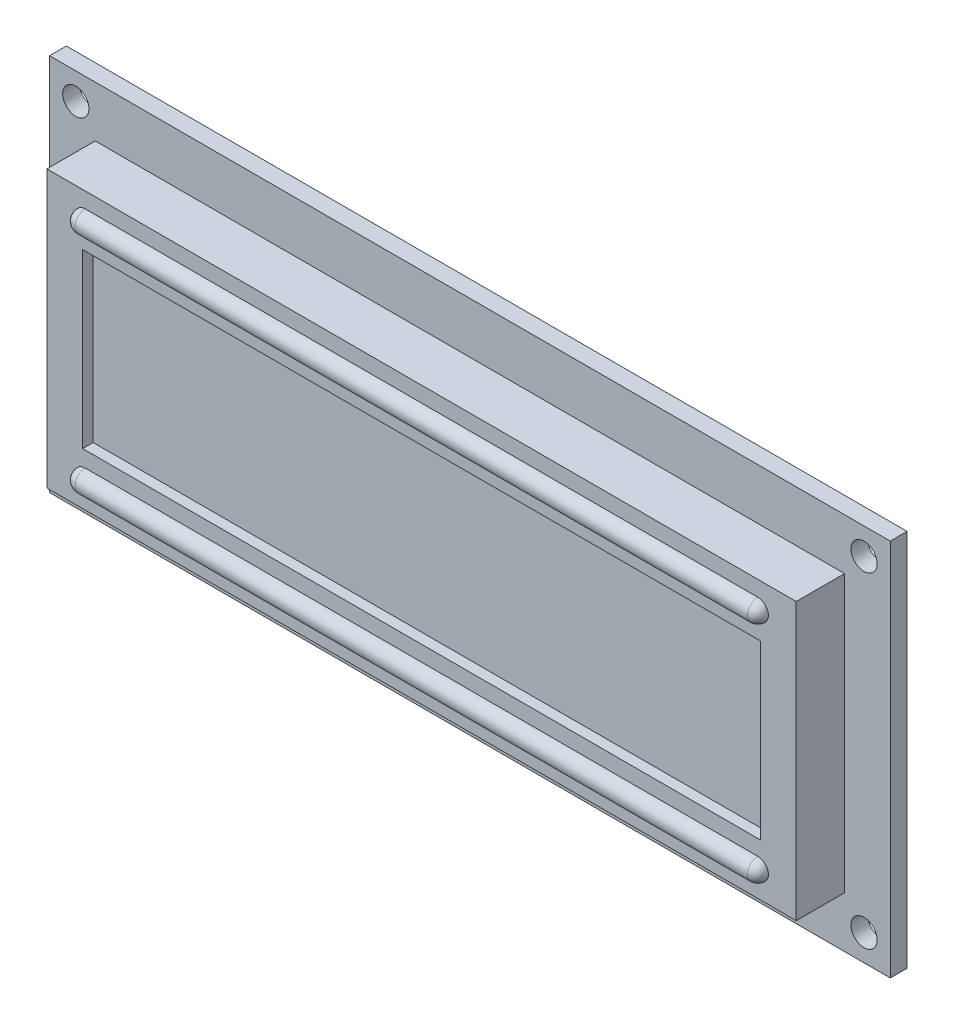
ISO-10303-21;
HEADER;
FILE_DESCRIPTION(('STEP AP214'),'2;1');
FILE_NAME('part.step','',(''),(''),'','','');
FILE_SCHEMA(('AUTOMOTIVE_DESIGN { 1 0 10303 214 1 1 1 1 }'));
ENDSEC;
DATA;
#1=APPLICATION_CONTEXT('core data for automotive mechanical design processes');
#2=APPLICATION_PROTOCOL_DEFINITION('international standard','automotive_design',2000,#1);
#3=PRODUCT_CONTEXT('',#1,'mechanical');
#4=PRODUCT('Part','Part','',(#3));
#5=PRODUCT_RELATED_PRODUCT_CATEGORY('part','',(#4));
#6=PRODUCT_DEFINITION_FORMATION('','',#4);
#7=PRODUCT_DEFINITION_CONTEXT('part definition',#1,'design');
#8=PRODUCT_DEFINITION('design','',#6,#7);
#9=PRODUCT_DEFINITION_SHAPE('','',#8);
#10=(LENGTH_UNIT() NAMED_UNIT(*) SI_UNIT(.MILLI.,.METRE.));
#11=(NAMED_UNIT(*) PLANE_ANGLE_UNIT() SI_UNIT($,.RADIAN.));
#12=(NAMED_UNIT(*) SI_UNIT($,.STERADIAN.) SOLID_ANGLE_UNIT());
#13=UNCERTAINTY_MEASURE_WITH_UNIT(LENGTH_MEASURE(1.E-05),#10,'distance_accuracy_value','');
#14=(GEOMETRIC_REPRESENTATION_CONTEXT(3) GLOBAL_UNCERTAINTY_ASSIGNED_CONTEXT((#13)) GLOBAL_UNIT_ASSIGNED_CONTEXT((#10,
#11,#12)) REPRESENTATION_CONTEXT('',''));
#15=CARTESIAN_POINT('',(0.,0.,0.));
#16=DIRECTION('',(0.,0.,1.));
#17=DIRECTION('',(1.,0.,0.));
#18=AXIS2_PLACEMENT_3D('',#15,#16,#17);
#19=CARTESIAN_POINT('',(0.,0.,6.2));
#20=DIRECTION('',(0.,0.,1.));
#21=DIRECTION('',(1.,0.,0.));
#22=AXIS2_PLACEMENT_3D('',#19,#20,#21);
#23=PLANE('',#22);
#24=DIRECTION('',(0.,-1.,0.));
#25=VECTOR('',#24,1.);
#26=CARTESIAN_POINT('',(75.65,0.,6.2));
#27=LINE('',#26,#25);
#28=CARTESIAN_POINT('',(75.65,31.15,6.2));
#29=VERTEX_POINT('',#28);
#30=CARTESIAN_POINT('',(75.65,4.85,6.2));
#31=VERTEX_POINT('',#30);
#32=EDGE_CURVE('E208',#29,#31,#27,.T.);
#33=ORIENTED_EDGE('',*,*,#32,.F.);
#34=DIRECTION('',(1.,0.,0.));
#35=VECTOR('',#34,1.);
#36=CARTESIAN_POINT('',(0.,31.15,6.2));
#37=LINE('',#36,#35);
#38=CARTESIAN_POINT('',(4.35,31.15,6.2));
#39=VERTEX_POINT('',#38);
#40=EDGE_CURVE('E211',#39,#29,#37,.T.);
#41=ORIENTED_EDGE('',*,*,#40,.F.);
#42=DIRECTION('',(0.,-1.,0.));
#43=VECTOR('',#42,1.);
#44=CARTESIAN_POINT('',(4.35000000000001,0.,6.2));
#45=LINE('',#44,#43);
#46=CARTESIAN_POINT('',(4.35000000000001,4.85,6.2));
#47=VERTEX_POINT('',#46);
#48=EDGE_CURVE('E215',#39,#47,#45,.T.);
#49=ORIENTED_EDGE('',*,*,#48,.T.);
#50=DIRECTION('',(1.,0.,0.));
#51=VECTOR('',#50,1.);
#52=CARTESIAN_POINT('',(0.,4.85,6.2));
#53=LINE('',#52,#51);
#54=EDGE_CURVE('E217',#47,#31,#53,.T.);
#55=ORIENTED_EDGE('',*,*,#54,.T.);
#56=EDGE_LOOP('',(#33,#41,#49,#55));
#57=FACE_BOUND('',#56,.T.);
#58=DIRECTION('',(1.,0.,0.));
#59=VECTOR('',#58,1.);
#60=CARTESIAN_POINT('',(0.,26.2,6.2));
#61=LINE('',#60,#59);
#62=CARTESIAN_POINT('',(7.75,26.2,6.2));
#63=VERTEX_POINT('',#62);
#64=CARTESIAN_POINT('',(72.25,26.2,6.2));
#65=VERTEX_POINT('',#64);
#66=EDGE_CURVE('E192',#63,#65,#61,.T.);
#67=ORIENTED_EDGE('',*,*,#66,.T.);
#68=DIRECTION('',(0.,-1.,0.));
#69=VECTOR('',#68,1.);
#70=CARTESIAN_POINT('',(72.25,0.,6.2));
#71=LINE('',#70,#69);
#72=CARTESIAN_POINT('',(72.25,9.8,6.2));
#73=VERTEX_POINT('',#72);
#74=EDGE_CURVE('E53',#65,#73,#71,.T.);
#75=ORIENTED_EDGE('',*,*,#74,.T.);
#76=DIRECTION('',(1.,0.,0.));
#77=VECTOR('',#76,1.);
#78=CARTESIAN_POINT('',(0.,9.8,6.2));
#79=LINE('',#78,#77);
#80=CARTESIAN_POINT('',(7.75000000000001,9.8,6.2));
#81=VERTEX_POINT('',#80);
#82=EDGE_CURVE('E182',#81,#73,#79,.T.);
#83=ORIENTED_EDGE('',*,*,#82,.F.);
#84=DIRECTION('',(0.,-1.,0.));
#85=VECTOR('',#84,1.);
#86=CARTESIAN_POINT('',(7.75000000000001,0.,6.2));
#87=LINE('',#86,#85);
#88=EDGE_CURVE('E195',#63,#81,#87,.T.);
#89=ORIENTED_EDGE('',*,*,#88,.F.);
#90=EDGE_LOOP('',(#67,#75,#83,#89));
#91=FACE_BOUND('',#90,.T.);
#92=CARTESIAN_POINT('',(8.00000000000001,28.675,6.2));
#93=DIRECTION('',(0.,0.,1.));
#94=DIRECTION('',(1.,0.,0.));
#95=AXIS2_PLACEMENT_3D('',#92,#93,#94);
#96=CIRCLE('',#95,1.);
#97=CARTESIAN_POINT('',(8.,29.675,6.2));
#98=VERTEX_POINT('',#97);
#99=CARTESIAN_POINT('',(8.,27.675,6.2));
#100=VERTEX_POINT('',#99);
#101=EDGE_CURVE('E300',#98,#100,#96,.T.);
#102=ORIENTED_EDGE('',*,*,#101,.F.);
#103=DIRECTION('',(-1.,0.,0.));
#104=VECTOR('',#103,1.);
#105=CARTESIAN_POINT('',(72.,29.675,6.2));
#106=LINE('',#105,#104);
#107=CARTESIAN_POINT('',(72.,29.675,6.2));
#108=VERTEX_POINT('',#107);
#109=EDGE_CURVE('E160',#98,#108,#106,.F.);
#110=ORIENTED_EDGE('',*,*,#109,.T.);
#111=CARTESIAN_POINT('',(72.,28.675,6.2));
#112=DIRECTION('',(0.,0.,1.));
#113=DIRECTION('',(1.,0.,0.));
#114=AXIS2_PLACEMENT_3D('',#111,#112,#113);
#115=CIRCLE('',#114,0.999999999999997);
#116=CARTESIAN_POINT('',(72.,27.675,6.2));
#117=VERTEX_POINT('',#116);
#118=EDGE_CURVE('E172',#117,#108,#115,.T.);
#119=ORIENTED_EDGE('',*,*,#118,.F.);
#120=DIRECTION('',(-1.,0.,0.));
#121=VECTOR('',#120,1.);
#122=CARTESIAN_POINT('',(72.,27.675,6.2));
#123=LINE('',#122,#121);
#124=EDGE_CURVE('E291',#117,#100,#123,.T.);
#125=ORIENTED_EDGE('',*,*,#124,.T.);
#126=EDGE_LOOP('',(#102,#110,#119,#125));
#127=FACE_BOUND('',#126,.T.);
#128=DIRECTION('',(-1.,0.,0.));
#129=VECTOR('',#128,1.);
#130=CARTESIAN_POINT('',(72.,8.32499999999999,6.2));
#131=LINE('',#130,#129);
#132=CARTESIAN_POINT('',(8.,8.325,6.2));
#133=VERTEX_POINT('',#132);
#134=CARTESIAN_POINT('',(72.,8.32499999999999,6.2));
#135=VERTEX_POINT('',#134);
#136=EDGE_CURVE('E11',#133,#135,#131,.F.);
#137=ORIENTED_EDGE('',*,*,#136,.T.);
#138=CARTESIAN_POINT('',(72.,7.32499999999999,6.2));
#139=DIRECTION('',(0.,0.,1.));
#140=DIRECTION('',(1.,0.,0.));
#141=AXIS2_PLACEMENT_3D('',#138,#139,#140);
#142=CIRCLE('',#141,0.999999999999997);
#143=CARTESIAN_POINT('',(72.,6.325,6.2));
#144=VERTEX_POINT('',#143);
#145=EDGE_CURVE('E162',#135,#144,#142,.F.);
#146=ORIENTED_EDGE('',*,*,#145,.T.);
#147=DIRECTION('',(-1.,0.,0.));
#148=VECTOR('',#147,1.);
#149=CARTESIAN_POINT('',(72.,6.32499999999999,6.2));
#150=LINE('',#149,#148);
#151=CARTESIAN_POINT('',(8.,6.32499999999999,6.2));
#152=VERTEX_POINT('',#151);
#153=EDGE_CURVE('E46',#144,#152,#150,.T.);
#154=ORIENTED_EDGE('',*,*,#153,.T.);
#155=CARTESIAN_POINT('',(8.00000000000001,7.32499999999999,6.2));
#156=DIRECTION('',(0.,0.,1.));
#157=DIRECTION('',(1.,0.,0.));
#158=AXIS2_PLACEMENT_3D('',#155,#156,#157);
#159=CIRCLE('',#158,1.);
#160=EDGE_CURVE('E164',#133,#152,#159,.T.);
#161=ORIENTED_EDGE('',*,*,#160,.F.);
#162=EDGE_LOOP('',(#137,#146,#154,#161));
#163=FACE_BOUND('',#162,.T.);
#164=ADVANCED_FACE('F38',(#57,#91,#127,#163),#23,.T.);
#165=CARTESIAN_POINT('',(0.,0.,1.6));
#166=DIRECTION('',(0.,0.,-1.));
#167=DIRECTION('',(-1.,0.,0.));
#168=AXIS2_PLACEMENT_3D('',#165,#166,#167);
#169=PLANE('',#168);
#170=DIRECTION('',(1.,0.,0.));
#171=VECTOR('',#170,1.);
#172=CARTESIAN_POINT('',(0.,31.15,1.6));
#173=LINE('',#172,#171);
#174=CARTESIAN_POINT('',(4.35,31.15,1.6));
#175=VERTEX_POINT('',#174);
#176=CARTESIAN_POINT('',(75.65,31.15,1.6));
#177=VERTEX_POINT('',#176);
#178=EDGE_CURVE('E61',#175,#177,#173,.T.);
#179=ORIENTED_EDGE('',*,*,#178,.T.);
#180=DIRECTION('',(0.,-1.,0.));
#181=VECTOR('',#180,1.);
#182=CARTESIAN_POINT('',(75.65,0.,1.6));
#183=LINE('',#182,#181);
#184=CARTESIAN_POINT('',(75.65,4.85,1.6));
#185=VERTEX_POINT('',#184);
#186=EDGE_CURVE('E202',#177,#185,#183,.T.);
#187=ORIENTED_EDGE('',*,*,#186,.T.);
#188=DIRECTION('',(1.,0.,0.));
#189=VECTOR('',#188,1.);
#190=CARTESIAN_POINT('',(0.,4.85,1.6));
#191=LINE('',#190,#189);
#192=CARTESIAN_POINT('',(4.35000000000001,4.85,1.6));
#193=VERTEX_POINT('',#192);
#194=EDGE_CURVE('E212',#193,#185,#191,.T.);
#195=ORIENTED_EDGE('',*,*,#194,.F.);
#196=DIRECTION('',(0.,-1.,0.));
#197=VECTOR('',#196,1.);
#198=CARTESIAN_POINT('',(4.35000000000001,0.,1.6));
#199=LINE('',#198,#197);
#200=EDGE_CURVE('E222',#175,#193,#199,.T.);
#201=ORIENTED_EDGE('',*,*,#200,.F.);
#202=EDGE_LOOP('',(#179,#187,#195,#201));
#203=FACE_BOUND('',#202,.T.);
#204=CARTESIAN_POINT('',(2.5,2.5,1.6));
#205=DIRECTION('',(0.,0.,1.));
#206=DIRECTION('',(1.,0.,0.));
#207=AXIS2_PLACEMENT_3D('',#204,#205,#206);
#208=CIRCLE('',#207,1.25);
#209=CARTESIAN_POINT('',(3.75,2.5,1.6));
#210=VERTEX_POINT('',#209);
#211=EDGE_CURVE('E244',#210,#210,#208,.T.);
#212=ORIENTED_EDGE('',*,*,#211,.F.);
#213=EDGE_LOOP('',(#212));
#214=FACE_BOUND('',#213,.T.);
#215=CARTESIAN_POINT('',(77.5,33.5,1.6));
#216=DIRECTION('',(0.,0.,1.));
#217=DIRECTION('',(1.,0.,0.));
#218=AXIS2_PLACEMENT_3D('',#215,#216,#217);
#219=CIRCLE('',#218,1.25);
#220=CARTESIAN_POINT('',(78.75,33.5,1.6));
#221=VERTEX_POINT('',#220);
#222=EDGE_CURVE('E256',#221,#221,#219,.T.);
#223=ORIENTED_EDGE('',*,*,#222,.F.);
#224=EDGE_LOOP('',(#223));
#225=FACE_BOUND('',#224,.T.);
#226=DIRECTION('',(0.,-1.,0.));
#227=VECTOR('',#226,1.);
#228=CARTESIAN_POINT('',(0.,0.,1.6));
#229=LINE('',#228,#227);
#230=CARTESIAN_POINT('',(0.,36.,1.6));
#231=VERTEX_POINT('',#230);
#232=CARTESIAN_POINT('',(0.,0.,1.6));
#233=VERTEX_POINT('',#232);
#234=EDGE_CURVE('E262',#231,#233,#229,.T.);
#235=ORIENTED_EDGE('',*,*,#234,.T.);
#236=DIRECTION('',(1.,0.,0.));
#237=VECTOR('',#236,1.);
#238=CARTESIAN_POINT('',(0.,0.,1.6));
#239=LINE('',#238,#237);
#240=CARTESIAN_POINT('',(80.,0.,1.6));
#241=VERTEX_POINT('',#240);
#242=EDGE_CURVE('E265',#233,#241,#239,.T.);
#243=ORIENTED_EDGE('',*,*,#242,.T.);
#244=DIRECTION('',(0.,1.,0.));
#245=VECTOR('',#244,1.);
#246=CARTESIAN_POINT('',(80.,0.,1.6));
#247=LINE('',#246,#245);
#248=CARTESIAN_POINT('',(80.,36.,1.6));
#249=VERTEX_POINT('',#248);
#250=EDGE_CURVE('E268',#241,#249,#247,.T.);
#251=ORIENTED_EDGE('',*,*,#250,.T.);
#252=DIRECTION('',(-1.,0.,0.));
#253=VECTOR('',#252,1.);
#254=CARTESIAN_POINT('',(0.,36.,1.6));
#255=LINE('',#254,#253);
#256=EDGE_CURVE('E270',#249,#231,#255,.T.);
#257=ORIENTED_EDGE('',*,*,#256,.T.);
#258=EDGE_LOOP('',(#235,#243,#251,#257));
#259=FACE_BOUND('',#258,.T.);
#260=CARTESIAN_POINT('',(77.5,2.5,1.6));
#261=DIRECTION('',(0.,0.,1.));
#262=DIRECTION('',(1.,0.,0.));
#263=AXIS2_PLACEMENT_3D('',#260,#261,#262);
#264=CIRCLE('',#263,1.25);
#265=CARTESIAN_POINT('',(78.75,2.5,1.6));
#266=VERTEX_POINT('',#265);
#267=EDGE_CURVE('E250',#266,#266,#264,.T.);
#268=ORIENTED_EDGE('',*,*,#267,.F.);
#269=EDGE_LOOP('',(#268));
#270=FACE_BOUND('',#269,.T.);
#271=CARTESIAN_POINT('',(2.5,33.5,1.6));
#272=DIRECTION('',(0.,0.,1.));
#273=DIRECTION('',(1.,0.,0.));
#274=AXIS2_PLACEMENT_3D('',#271,#272,#273);
#275=CIRCLE('',#274,1.25);
#276=CARTESIAN_POINT('',(3.75,33.5,1.6));
#277=VERTEX_POINT('',#276);
#278=EDGE_CURVE('E238',#277,#277,#275,.T.);
#279=ORIENTED_EDGE('',*,*,#278,.F.);
#280=EDGE_LOOP('',(#279));
#281=FACE_BOUND('',#280,.T.);
#282=ADVANCED_FACE('F318',(#203,#214,#225,#259,#270,#281),#169,.F.);
#283=CARTESIAN_POINT('',(0.,0.,0.));
#284=DIRECTION('',(0.,0.,-1.));
#285=DIRECTION('',(-1.,0.,0.));
#286=AXIS2_PLACEMENT_3D('',#283,#284,#285);
#287=PLANE('',#286);
#288=CARTESIAN_POINT('',(2.5,2.5,0.));
#289=DIRECTION('',(0.,0.,1.));
#290=DIRECTION('',(1.,0.,0.));
#291=AXIS2_PLACEMENT_3D('',#288,#289,#290);
#292=CIRCLE('',#291,1.25);
#293=CARTESIAN_POINT('',(3.75,2.5,0.));
#294=VERTEX_POINT('',#293);
#295=EDGE_CURVE('E241',#294,#294,#292,.T.);
#296=ORIENTED_EDGE('',*,*,#295,.T.);
#297=EDGE_LOOP('',(#296));
#298=FACE_BOUND('',#297,.T.);
#299=CARTESIAN_POINT('',(77.5,33.5,0.));
#300=DIRECTION('',(0.,0.,1.));
#301=DIRECTION('',(1.,0.,0.));
#302=AXIS2_PLACEMENT_3D('',#299,#300,#301);
#303=CIRCLE('',#302,1.25);
#304=CARTESIAN_POINT('',(78.75,33.5,0.));
#305=VERTEX_POINT('',#304);
#306=EDGE_CURVE('E253',#305,#305,#303,.T.);
#307=ORIENTED_EDGE('',*,*,#306,.T.);
#308=EDGE_LOOP('',(#307));
#309=FACE_BOUND('',#308,.T.);
#310=DIRECTION('',(0.,-1.,0.));
#311=VECTOR('',#310,1.);
#312=CARTESIAN_POINT('',(0.,0.,0.));
#313=LINE('',#312,#311);
#314=CARTESIAN_POINT('',(0.,36.,0.));
#315=VERTEX_POINT('',#314);
#316=CARTESIAN_POINT('',(0.,0.,0.));
#317=VERTEX_POINT('',#316);
#318=EDGE_CURVE('E259',#315,#317,#313,.T.);
#319=ORIENTED_EDGE('',*,*,#318,.F.);
#320=DIRECTION('',(-1.,0.,0.));
#321=VECTOR('',#320,1.);
#322=CARTESIAN_POINT('',(0.,36.,0.));
#323=LINE('',#322,#321);
#324=CARTESIAN_POINT('',(80.,36.,0.));
#325=VERTEX_POINT('',#324);
#326=EDGE_CURVE('E266',#325,#315,#323,.T.);
#327=ORIENTED_EDGE('',*,*,#326,.F.);
#328=DIRECTION('',(0.,1.,0.));
#329=VECTOR('',#328,1.);
#330=CARTESIAN_POINT('',(80.,0.,0.));
#331=LINE('',#330,#329);
#332=CARTESIAN_POINT('',(80.,0.,0.));
#333=VERTEX_POINT('',#332);
#334=EDGE_CURVE('E277',#333,#325,#331,.T.);
#335=ORIENTED_EDGE('',*,*,#334,.F.);
#336=DIRECTION('',(1.,0.,0.));
#337=VECTOR('',#336,1.);
#338=CARTESIAN_POINT('',(0.,0.,0.));
#339=LINE('',#338,#337);
#340=EDGE_CURVE('E275',#317,#333,#339,.T.);
#341=ORIENTED_EDGE('',*,*,#340,.F.);
#342=EDGE_LOOP('',(#319,#327,#335,#341));
#343=FACE_BOUND('',#342,.T.);
#344=CARTESIAN_POINT('',(77.5,2.5,0.));
#345=DIRECTION('',(0.,0.,1.));
#346=DIRECTION('',(1.,0.,0.));
#347=AXIS2_PLACEMENT_3D('',#344,#345,#346);
#348=CIRCLE('',#347,1.25);
#349=CARTESIAN_POINT('',(78.75,2.5,0.));
#350=VERTEX_POINT('',#349);
#351=EDGE_CURVE('E247',#350,#350,#348,.T.);
#352=ORIENTED_EDGE('',*,*,#351,.T.);
#353=EDGE_LOOP('',(#352));
#354=FACE_BOUND('',#353,.T.);
#355=CARTESIAN_POINT('',(2.5,33.5,0.));
#356=DIRECTION('',(0.,0.,1.));
#357=DIRECTION('',(1.,0.,0.));
#358=AXIS2_PLACEMENT_3D('',#355,#356,#357);
#359=CIRCLE('',#358,1.25);
#360=CARTESIAN_POINT('',(3.75,33.5,0.));
#361=VERTEX_POINT('',#360);
#362=EDGE_CURVE('E237',#361,#361,#359,.T.);
#363=ORIENTED_EDGE('',*,*,#362,.T.);
#364=EDGE_LOOP('',(#363));
#365=FACE_BOUND('',#364,.T.);
#366=ADVANCED_FACE('F324',(#298,#309,#343,#354,#365),#287,.T.);
#367=CARTESIAN_POINT('',(0.,0.,1.6));
#368=DIRECTION('',(1.,0.,0.));
#369=DIRECTION('',(0.,0.,-1.));
#370=AXIS2_PLACEMENT_3D('',#367,#368,#369);
#371=PLANE('',#370);
#372=ORIENTED_EDGE('',*,*,#318,.T.);
#373=DIRECTION('',(0.,0.,-1.));
#374=VECTOR('',#373,1.);
#375=CARTESIAN_POINT('',(0.,0.,1.6));
#376=LINE('',#375,#374);
#377=EDGE_CURVE('E288',#233,#317,#376,.T.);
#378=ORIENTED_EDGE('',*,*,#377,.F.);
#379=ORIENTED_EDGE('',*,*,#234,.F.);
#380=DIRECTION('',(0.,0.,-1.));
#381=VECTOR('',#380,1.);
#382=CARTESIAN_POINT('',(0.,36.,1.6));
#383=LINE('',#382,#381);
#384=EDGE_CURVE('E272',#231,#315,#383,.T.);
#385=ORIENTED_EDGE('',*,*,#384,.T.);
#386=EDGE_LOOP('',(#372,#378,#379,#385));
#387=FACE_BOUND('',#386,.T.);
#388=ADVANCED_FACE('F40',(#387),#371,.F.);
#389=CARTESIAN_POINT('',(0.,0.,1.6));
#390=DIRECTION('',(0.,1.,0.));
#391=DIRECTION('',(0.,0.,1.));
#392=AXIS2_PLACEMENT_3D('',#389,#390,#391);
#393=PLANE('',#392);
#394=ORIENTED_EDGE('',*,*,#340,.T.);
#395=DIRECTION('',(0.,0.,-1.));
#396=VECTOR('',#395,1.);
#397=CARTESIAN_POINT('',(80.,0.,1.6));
#398=LINE('',#397,#396);
#399=EDGE_CURVE('E285',#241,#333,#398,.T.);
#400=ORIENTED_EDGE('',*,*,#399,.F.);
#401=ORIENTED_EDGE('',*,*,#242,.F.);
#402=ORIENTED_EDGE('',*,*,#377,.T.);
#403=EDGE_LOOP('',(#394,#400,#401,#402));
#404=FACE_BOUND('',#403,.T.);
#405=ADVANCED_FACE('F373',(#404),#393,.F.);
#406=CARTESIAN_POINT('',(80.,0.,1.6));
#407=DIRECTION('',(-1.,0.,0.));
#408=DIRECTION('',(0.,0.,1.));
#409=AXIS2_PLACEMENT_3D('',#406,#407,#408);
#410=PLANE('',#409);
#411=ORIENTED_EDGE('',*,*,#334,.T.);
#412=DIRECTION('',(0.,0.,-1.));
#413=VECTOR('',#412,1.);
#414=CARTESIAN_POINT('',(80.,36.,1.6));
#415=LINE('',#414,#413);
#416=EDGE_CURVE('E282',#249,#325,#415,.T.);
#417=ORIENTED_EDGE('',*,*,#416,.F.);
#418=ORIENTED_EDGE('',*,*,#250,.F.);
#419=ORIENTED_EDGE('',*,*,#399,.T.);
#420=EDGE_LOOP('',(#411,#417,#418,#419));
#421=FACE_BOUND('',#420,.T.);
#422=ADVANCED_FACE('F370',(#421),#410,.F.);
#423=CARTESIAN_POINT('',(0.,36.,1.6));
#424=DIRECTION('',(0.,-1.,0.));
#425=DIRECTION('',(0.,0.,-1.));
#426=AXIS2_PLACEMENT_3D('',#423,#424,#425);
#427=PLANE('',#426);
#428=ORIENTED_EDGE('',*,*,#326,.T.);
#429=ORIENTED_EDGE('',*,*,#384,.F.);
#430=ORIENTED_EDGE('',*,*,#256,.F.);
#431=ORIENTED_EDGE('',*,*,#416,.T.);
#432=EDGE_LOOP('',(#428,#429,#430,#431));
#433=FACE_BOUND('',#432,.T.);
#434=ADVANCED_FACE('F362',(#433),#427,.F.);
#435=CARTESIAN_POINT('',(77.5,33.5,1.6));
#436=DIRECTION('',(0.,0.,-1.));
#437=DIRECTION('',(-1.,0.,0.));
#438=AXIS2_PLACEMENT_3D('',#435,#436,#437);
#439=CYLINDRICAL_SURFACE('',#438,1.25);
#440=ORIENTED_EDGE('',*,*,#222,.T.);
#441=EDGE_LOOP('',(#440));
#442=FACE_BOUND('',#441,.T.);
#443=ORIENTED_EDGE('',*,*,#306,.F.);
#444=EDGE_LOOP('',(#443));
#445=FACE_BOUND('',#444,.T.);
#446=ADVANCED_FACE('F359',(#442,#445),#439,.F.);
#447=CARTESIAN_POINT('',(77.5,2.5,1.6));
#448=DIRECTION('',(0.,0.,-1.));
#449=DIRECTION('',(-1.,0.,0.));
#450=AXIS2_PLACEMENT_3D('',#447,#448,#449);
#451=CYLINDRICAL_SURFACE('',#450,1.25);
#452=ORIENTED_EDGE('',*,*,#267,.T.);
#453=EDGE_LOOP('',(#452));
#454=FACE_BOUND('',#453,.T.);
#455=ORIENTED_EDGE('',*,*,#351,.F.);
#456=EDGE_LOOP('',(#455));
#457=FACE_BOUND('',#456,.T.);
#458=ADVANCED_FACE('F355',(#454,#457),#451,.F.);
#459=CARTESIAN_POINT('',(2.5,2.5,1.6));
#460=DIRECTION('',(0.,0.,-1.));
#461=DIRECTION('',(-1.,0.,0.));
#462=AXIS2_PLACEMENT_3D('',#459,#460,#461);
#463=CYLINDRICAL_SURFACE('',#462,1.25);
#464=ORIENTED_EDGE('',*,*,#211,.T.);
#465=EDGE_LOOP('',(#464));
#466=FACE_BOUND('',#465,.T.);
#467=ORIENTED_EDGE('',*,*,#295,.F.);
#468=EDGE_LOOP('',(#467));
#469=FACE_BOUND('',#468,.T.);
#470=ADVANCED_FACE('F351',(#466,#469),#463,.F.);
#471=CARTESIAN_POINT('',(2.5,33.5,1.6));
#472=DIRECTION('',(0.,0.,-1.));
#473=DIRECTION('',(-1.,0.,0.));
#474=AXIS2_PLACEMENT_3D('',#471,#472,#473);
#475=CYLINDRICAL_SURFACE('',#474,1.25);
#476=ORIENTED_EDGE('',*,*,#278,.T.);
#477=EDGE_LOOP('',(#476));
#478=FACE_BOUND('',#477,.T.);
#479=ORIENTED_EDGE('',*,*,#362,.F.);
#480=EDGE_LOOP('',(#479));
#481=FACE_BOUND('',#480,.T.);
#482=ADVANCED_FACE('F347',(#478,#481),#475,.F.);
#483=CARTESIAN_POINT('',(75.65,0.,6.2));
#484=DIRECTION('',(1.,0.,0.));
#485=DIRECTION('',(0.,0.,-1.));
#486=AXIS2_PLACEMENT_3D('',#483,#484,#485);
#487=PLANE('',#486);
#488=ORIENTED_EDGE('',*,*,#186,.F.);
#489=DIRECTION('',(0.,0.,-1.));
#490=VECTOR('',#489,1.);
#491=CARTESIAN_POINT('',(75.65,31.15,6.2));
#492=LINE('',#491,#490);
#493=EDGE_CURVE('E235',#29,#177,#492,.T.);
#494=ORIENTED_EDGE('',*,*,#493,.F.);
#495=ORIENTED_EDGE('',*,*,#32,.T.);
#496=DIRECTION('',(0.,0.,-1.));
#497=VECTOR('',#496,1.);
#498=CARTESIAN_POINT('',(75.65,4.85,6.2));
#499=LINE('',#498,#497);
#500=EDGE_CURVE('E219',#31,#185,#499,.T.);
#501=ORIENTED_EDGE('',*,*,#500,.T.);
#502=EDGE_LOOP('',(#488,#494,#495,#501));
#503=FACE_BOUND('',#502,.T.);
#504=ADVANCED_FACE('F343',(#503),#487,.T.);
#505=CARTESIAN_POINT('',(0.,31.15,6.2));
#506=DIRECTION('',(0.,1.,0.));
#507=DIRECTION('',(0.,0.,1.));
#508=AXIS2_PLACEMENT_3D('',#505,#506,#507);
#509=PLANE('',#508);
#510=ORIENTED_EDGE('',*,*,#178,.F.);
#511=DIRECTION('',(0.,0.,-1.));
#512=VECTOR('',#511,1.);
#513=CARTESIAN_POINT('',(4.35,31.15,6.2));
#514=LINE('',#513,#512);
#515=EDGE_CURVE('E232',#39,#175,#514,.T.);
#516=ORIENTED_EDGE('',*,*,#515,.F.);
#517=ORIENTED_EDGE('',*,*,#40,.T.);
#518=ORIENTED_EDGE('',*,*,#493,.T.);
#519=EDGE_LOOP('',(#510,#516,#517,#518));
#520=FACE_BOUND('',#519,.T.);
#521=ADVANCED_FACE('F339',(#520),#509,.T.);
#522=CARTESIAN_POINT('',(4.35000000000001,0.,6.2));
#523=DIRECTION('',(1.,0.,0.));
#524=DIRECTION('',(0.,1.,0.));
#525=AXIS2_PLACEMENT_3D('',#522,#523,#524);
#526=PLANE('',#525);
#527=ORIENTED_EDGE('',*,*,#200,.T.);
#528=DIRECTION('',(0.,0.,-1.));
#529=VECTOR('',#528,1.);
#530=CARTESIAN_POINT('',(4.35000000000001,4.85,6.2));
#531=LINE('',#530,#529);
#532=EDGE_CURVE('E229',#47,#193,#531,.T.);
#533=ORIENTED_EDGE('',*,*,#532,.F.);
#534=ORIENTED_EDGE('',*,*,#48,.F.);
#535=ORIENTED_EDGE('',*,*,#515,.T.);
#536=EDGE_LOOP('',(#527,#533,#534,#535));
#537=FACE_BOUND('',#536,.T.);
#538=ADVANCED_FACE('F335',(#537),#526,.F.);
#539=CARTESIAN_POINT('',(0.,4.85,6.2));
#540=DIRECTION('',(0.,1.,0.));
#541=DIRECTION('',(0.,0.,1.));
#542=AXIS2_PLACEMENT_3D('',#539,#540,#541);
#543=PLANE('',#542);
#544=ORIENTED_EDGE('',*,*,#194,.T.);
#545=ORIENTED_EDGE('',*,*,#500,.F.);
#546=ORIENTED_EDGE('',*,*,#54,.F.);
#547=ORIENTED_EDGE('',*,*,#532,.T.);
#548=EDGE_LOOP('',(#544,#545,#546,#547));
#549=FACE_BOUND('',#548,.T.);
#550=ADVANCED_FACE('F332',(#549),#543,.F.);
#551=CARTESIAN_POINT('',(72.25,0.,5.2));
#552=DIRECTION('',(-1.,0.,0.));
#553=DIRECTION('',(0.,0.,1.));
#554=AXIS2_PLACEMENT_3D('',#551,#552,#553);
#555=PLANE('',#554);
#556=ORIENTED_EDGE('',*,*,#74,.F.);
#557=DIRECTION('',(0.,0.,1.));
#558=VECTOR('',#557,1.);
#559=CARTESIAN_POINT('',(72.25,26.2,5.2));
#560=LINE('',#559,#558);
#561=CARTESIAN_POINT('',(72.25,26.2,5.2));
#562=VERTEX_POINT('',#561);
#563=EDGE_CURVE('E190',#562,#65,#560,.T.);
#564=ORIENTED_EDGE('',*,*,#563,.F.);
#565=DIRECTION('',(0.,-1.,0.));
#566=VECTOR('',#565,1.);
#567=CARTESIAN_POINT('',(72.25,0.,5.2));
#568=LINE('',#567,#566);
#569=CARTESIAN_POINT('',(72.25,9.8,5.2));
#570=VERTEX_POINT('',#569);
#571=EDGE_CURVE('E179',#562,#570,#568,.T.);
#572=ORIENTED_EDGE('',*,*,#571,.T.);
#573=DIRECTION('',(0.,0.,1.));
#574=VECTOR('',#573,1.);
#575=CARTESIAN_POINT('',(72.25,9.8,5.2));
#576=LINE('',#575,#574);
#577=EDGE_CURVE('E200',#570,#73,#576,.T.);
#578=ORIENTED_EDGE('',*,*,#577,.T.);
#579=EDGE_LOOP('',(#556,#564,#572,#578));
#580=FACE_BOUND('',#579,.T.);
#581=ADVANCED_FACE('F330',(#580),#555,.T.);
#582=CARTESIAN_POINT('',(0.,9.8,5.2));
#583=DIRECTION('',(0.,-1.,0.));
#584=DIRECTION('',(0.,0.,-1.));
#585=AXIS2_PLACEMENT_3D('',#582,#583,#584);
#586=PLANE('',#585);
#587=ORIENTED_EDGE('',*,*,#82,.T.);
#588=ORIENTED_EDGE('',*,*,#577,.F.);
#589=DIRECTION('',(1.,0.,0.));
#590=VECTOR('',#589,1.);
#591=CARTESIAN_POINT('',(0.,9.8,5.2));
#592=LINE('',#591,#590);
#593=CARTESIAN_POINT('',(7.75000000000001,9.8,5.2));
#594=VERTEX_POINT('',#593);
#595=EDGE_CURVE('E187',#594,#570,#592,.T.);
#596=ORIENTED_EDGE('',*,*,#595,.F.);
#597=DIRECTION('',(0.,0.,1.));
#598=VECTOR('',#597,1.);
#599=CARTESIAN_POINT('',(7.75000000000001,9.8,5.2));
#600=LINE('',#599,#598);
#601=EDGE_CURVE('E203',#594,#81,#600,.T.);
#602=ORIENTED_EDGE('',*,*,#601,.T.);
#603=EDGE_LOOP('',(#587,#588,#596,#602));
#604=FACE_BOUND('',#603,.T.);
#605=ADVANCED_FACE('F460',(#604),#586,.F.);
#606=CARTESIAN_POINT('',(7.75000000000001,0.,5.2));
#607=DIRECTION('',(-1.,0.,0.));
#608=DIRECTION('',(0.,-1.,0.));
#609=AXIS2_PLACEMENT_3D('',#606,#607,#608);
#610=PLANE('',#609);
#611=ORIENTED_EDGE('',*,*,#88,.T.);
#612=ORIENTED_EDGE('',*,*,#601,.F.);
#613=DIRECTION('',(0.,-1.,0.));
#614=VECTOR('',#613,1.);
#615=CARTESIAN_POINT('',(7.75000000000001,0.,5.2));
#616=LINE('',#615,#614);
#617=CARTESIAN_POINT('',(7.75,26.2,5.2));
#618=VERTEX_POINT('',#617);
#619=EDGE_CURVE('E184',#618,#594,#616,.T.);
#620=ORIENTED_EDGE('',*,*,#619,.F.);
#621=DIRECTION('',(0.,0.,1.));
#622=VECTOR('',#621,1.);
#623=CARTESIAN_POINT('',(7.75,26.2,5.2));
#624=LINE('',#623,#622);
#625=EDGE_CURVE('E205',#618,#63,#624,.T.);
#626=ORIENTED_EDGE('',*,*,#625,.T.);
#627=EDGE_LOOP('',(#611,#612,#620,#626));
#628=FACE_BOUND('',#627,.T.);
#629=ADVANCED_FACE('F471',(#628),#610,.F.);
#630=CARTESIAN_POINT('',(0.,26.2,5.2));
#631=DIRECTION('',(0.,-1.,0.));
#632=DIRECTION('',(0.,0.,-1.));
#633=AXIS2_PLACEMENT_3D('',#630,#631,#632);
#634=PLANE('',#633);
#635=ORIENTED_EDGE('',*,*,#66,.F.);
#636=ORIENTED_EDGE('',*,*,#625,.F.);
#637=DIRECTION('',(1.,0.,0.));
#638=VECTOR('',#637,1.);
#639=CARTESIAN_POINT('',(0.,26.2,5.2));
#640=LINE('',#639,#638);
#641=EDGE_CURVE('E181',#618,#562,#640,.T.);
#642=ORIENTED_EDGE('',*,*,#641,.T.);
#643=ORIENTED_EDGE('',*,*,#563,.T.);
#644=EDGE_LOOP('',(#635,#636,#642,#643));
#645=FACE_BOUND('',#644,.T.);
#646=ADVANCED_FACE('F482',(#645),#634,.T.);
#647=CARTESIAN_POINT('',(0.,0.,5.2));
#648=DIRECTION('',(0.,0.,1.));
#649=DIRECTION('',(1.,0.,0.));
#650=AXIS2_PLACEMENT_3D('',#647,#648,#649);
#651=PLANE('',#650);
#652=ORIENTED_EDGE('',*,*,#571,.F.);
#653=ORIENTED_EDGE('',*,*,#641,.F.);
#654=ORIENTED_EDGE('',*,*,#619,.T.);
#655=ORIENTED_EDGE('',*,*,#595,.T.);
#656=EDGE_LOOP('',(#652,#653,#654,#655));
#657=FACE_BOUND('',#656,.T.);
#658=ADVANCED_FACE('F492',(#657),#651,.T.);
#659=CARTESIAN_POINT('',(72.,28.675,6.2));
#660=DIRECTION('',(-1.,0.,0.));
#661=DIRECTION('',(0.,0.,1.));
#662=AXIS2_PLACEMENT_3D('',#659,#660,#661);
#663=CYLINDRICAL_SURFACE('',#662,1.);
#664=ORIENTED_EDGE('',*,*,#109,.F.);
#665=CARTESIAN_POINT('',(8.,28.675,6.2));
#666=DIRECTION('',(1.,0.,0.));
#667=DIRECTION('',(0.,0.,-1.));
#668=AXIS2_PLACEMENT_3D('',#665,#666,#667);
#669=CIRCLE('',#668,1.);
#670=EDGE_CURVE('E167',#98,#100,#669,.T.);
#671=ORIENTED_EDGE('',*,*,#670,.T.);
#672=ORIENTED_EDGE('',*,*,#124,.F.);
#673=CARTESIAN_POINT('',(72.,28.675,6.2));
#674=DIRECTION('',(1.,0.,0.));
#675=DIRECTION('',(0.,0.,-1.));
#676=AXIS2_PLACEMENT_3D('',#673,#674,#675);
#677=CIRCLE('',#676,1.);
#678=EDGE_CURVE('E170',#108,#117,#677,.T.);
#679=ORIENTED_EDGE('',*,*,#678,.F.);
#680=EDGE_LOOP('',(#664,#671,#672,#679));
#681=FACE_BOUND('',#680,.T.);
#682=ADVANCED_FACE('F501',(#681),#663,.T.);
#683=CARTESIAN_POINT('',(72.,7.32499999999999,6.2));
#684=DIRECTION('',(-1.,0.,0.));
#685=DIRECTION('',(0.,0.,1.));
#686=AXIS2_PLACEMENT_3D('',#683,#684,#685);
#687=CYLINDRICAL_SURFACE('',#686,1.);
#688=ORIENTED_EDGE('',*,*,#136,.F.);
#689=CARTESIAN_POINT('',(8.,7.32499999999999,6.2));
#690=DIRECTION('',(1.,0.,0.));
#691=DIRECTION('',(0.,0.,-1.));
#692=AXIS2_PLACEMENT_3D('',#689,#690,#691);
#693=CIRCLE('',#692,1.);
#694=EDGE_CURVE('E157',#133,#152,#693,.T.);
#695=ORIENTED_EDGE('',*,*,#694,.T.);
#696=ORIENTED_EDGE('',*,*,#153,.F.);
#697=CARTESIAN_POINT('',(72.,7.32499999999999,6.2));
#698=DIRECTION('',(1.,0.,0.));
#699=DIRECTION('',(0.,0.,-1.));
#700=AXIS2_PLACEMENT_3D('',#697,#698,#699);
#701=CIRCLE('',#700,1.);
#702=EDGE_CURVE('E156',#135,#144,#701,.T.);
#703=ORIENTED_EDGE('',*,*,#702,.F.);
#704=EDGE_LOOP('',(#688,#695,#696,#703));
#705=FACE_BOUND('',#704,.T.);
#706=ADVANCED_FACE('F154',(#705),#687,.T.);
#707=CARTESIAN_POINT('',(72.,28.675,6.2));
#708=DIRECTION('',(0.,1.,0.));
#709=DIRECTION('',(0.,0.,1.));
#710=AXIS2_PLACEMENT_3D('',#707,#708,#709);
#711=SPHERICAL_SURFACE('',#710,0.999999999999997);
#712=ORIENTED_EDGE('',*,*,#678,.T.);
#713=ORIENTED_EDGE('',*,*,#118,.T.);
#714=EDGE_LOOP('',(#712,#713));
#715=FACE_BOUND('',#714,.T.);
#716=ADVANCED_FACE('F303',(#715),#711,.T.);
#717=CARTESIAN_POINT('',(8.00000000000001,28.675,6.2));
#718=DIRECTION('',(0.,1.,0.));
#719=DIRECTION('',(1.,0.,0.));
#720=AXIS2_PLACEMENT_3D('',#717,#718,#719);
#721=SPHERICAL_SURFACE('',#720,1.);
#722=ORIENTED_EDGE('',*,*,#670,.F.);
#723=ORIENTED_EDGE('',*,*,#101,.T.);
#724=EDGE_LOOP('',(#722,#723));
#725=FACE_BOUND('',#724,.T.);
#726=ADVANCED_FACE('F309',(#725),#721,.T.);
#727=CARTESIAN_POINT('',(8.00000000000001,7.32499999999999,6.2));
#728=DIRECTION('',(0.,1.,0.));
#729=DIRECTION('',(1.,0.,0.));
#730=AXIS2_PLACEMENT_3D('',#727,#728,#729);
#731=SPHERICAL_SURFACE('',#730,1.);
#732=ORIENTED_EDGE('',*,*,#694,.F.);
#733=ORIENTED_EDGE('',*,*,#160,.T.);
#734=EDGE_LOOP('',(#732,#733));
#735=FACE_BOUND('',#734,.T.);
#736=ADVANCED_FACE('F307',(#735),#731,.T.);
#737=CARTESIAN_POINT('',(72.,7.32499999999999,6.2));
#738=DIRECTION('',(0.,1.,0.));
#739=DIRECTION('',(1.,0.,0.));
#740=AXIS2_PLACEMENT_3D('',#737,#738,#739);
#741=SPHERICAL_SURFACE('',#740,0.999999999999997);
#742=ORIENTED_EDGE('',*,*,#145,.F.);
#743=ORIENTED_EDGE('',*,*,#702,.T.);
#744=EDGE_LOOP('',(#742,#743));
#745=FACE_BOUND('',#744,.T.);
#746=ADVANCED_FACE('F166',(#745),#741,.T.);
#747=CLOSED_SHELL('',(#164,#282,#366,#388,#405,#422,#434,#446,#458,#470,#482,#504,#521,#538,
#550,#581,#605,#629,#646,#658,#682,#706,#716,#726,#736,#746));
#748=MANIFOLD_SOLID_BREP('B2',#747);
#749=ADVANCED_BREP_SHAPE_REPRESENTATION('',(#18,#748),#14);
#750=SHAPE_DEFINITION_REPRESENTATION(#9,#749);
ENDSEC;
END-ISO-10303-21;
